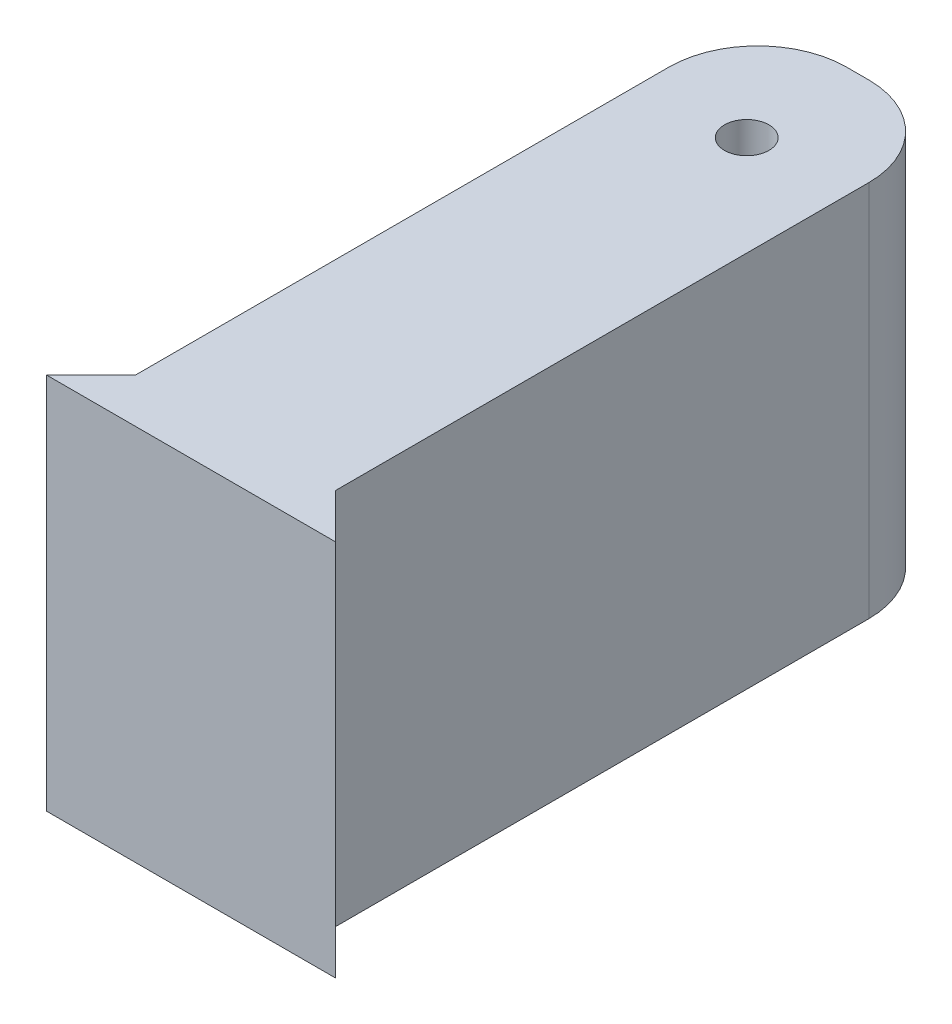
ISO-10303-21;
HEADER;
FILE_DESCRIPTION(('STEP AP214'),'2;1');
FILE_NAME('part.step','',(''),(''),'','','');
FILE_SCHEMA(('AUTOMOTIVE_DESIGN { 1 0 10303 214 1 1 1 1 }'));
ENDSEC;
DATA;
#1=APPLICATION_CONTEXT('core data for automotive mechanical design processes');
#2=APPLICATION_PROTOCOL_DEFINITION('international standard','automotive_design',2000,#1);
#3=PRODUCT_CONTEXT('',#1,'mechanical');
#4=PRODUCT('Part','Part','',(#3));
#5=PRODUCT_RELATED_PRODUCT_CATEGORY('part','',(#4));
#6=PRODUCT_DEFINITION_FORMATION('','',#4);
#7=PRODUCT_DEFINITION_CONTEXT('part definition',#1,'design');
#8=PRODUCT_DEFINITION('design','',#6,#7);
#9=PRODUCT_DEFINITION_SHAPE('','',#8);
#10=(LENGTH_UNIT() NAMED_UNIT(*) SI_UNIT(.MILLI.,.METRE.));
#11=(NAMED_UNIT(*) PLANE_ANGLE_UNIT() SI_UNIT($,.RADIAN.));
#12=(NAMED_UNIT(*) SI_UNIT($,.STERADIAN.) SOLID_ANGLE_UNIT());
#13=UNCERTAINTY_MEASURE_WITH_UNIT(LENGTH_MEASURE(1.E-05),#10,'distance_accuracy_value','');
#14=(GEOMETRIC_REPRESENTATION_CONTEXT(3) GLOBAL_UNCERTAINTY_ASSIGNED_CONTEXT((#13)) GLOBAL_UNIT_ASSIGNED_CONTEXT((#10,
#11,#12)) REPRESENTATION_CONTEXT('',''));
#15=CARTESIAN_POINT('',(0.,0.,0.));
#16=DIRECTION('',(0.,0.,1.));
#17=DIRECTION('',(1.,0.,0.));
#18=AXIS2_PLACEMENT_3D('',#15,#16,#17);
#19=CARTESIAN_POINT('',(0.,0.,-450.));
#20=DIRECTION('',(0.,0.,-1.));
#21=DIRECTION('',(-1.,0.,0.));
#22=AXIS2_PLACEMENT_3D('',#19,#20,#21);
#23=PLANE('',#22);
#24=DIRECTION('',(1.,0.,0.));
#25=VECTOR('',#24,1.);
#26=CARTESIAN_POINT('',(0.,-28.,-450.));
#27=LINE('',#26,#25);
#28=CARTESIAN_POINT('',(-61.0000000000001,-28.,-450.));
#29=VERTEX_POINT('',#28);
#30=CARTESIAN_POINT('',(-48.0000000000002,-28.,-450.));
#31=VERTEX_POINT('',#30);
#32=EDGE_CURVE('E464',#29,#31,#27,.T.);
#33=ORIENTED_EDGE('',*,*,#32,.F.);
#34=DIRECTION('',(0.,1.,0.));
#35=VECTOR('',#34,1.);
#36=CARTESIAN_POINT('',(-61.0000000000001,-44.9978351411707,-450.));
#37=LINE('',#36,#35);
#38=CARTESIAN_POINT('',(-61.0000000000001,-44.9978351411707,-450.));
#39=VERTEX_POINT('',#38);
#40=EDGE_CURVE('E452',#29,#39,#37,.F.);
#41=ORIENTED_EDGE('',*,*,#40,.T.);
#42=DIRECTION('',(1.,0.,0.));
#43=VECTOR('',#42,1.);
#44=CARTESIAN_POINT('',(-59.0000000000001,-44.9978351411707,-450.));
#45=LINE('',#44,#43);
#46=CARTESIAN_POINT('',(-48.0000000000001,-44.9978351411707,-450.));
#47=VERTEX_POINT('',#46);
#48=EDGE_CURVE('E501',#39,#47,#45,.T.);
#49=ORIENTED_EDGE('',*,*,#48,.T.);
#50=DIRECTION('',(0.,1.,0.));
#51=VECTOR('',#50,1.);
#52=CARTESIAN_POINT('',(-48.0000000000002,-28.,-450.));
#53=LINE('',#52,#51);
#54=EDGE_CURVE('E378',#47,#31,#53,.T.);
#55=ORIENTED_EDGE('',*,*,#54,.T.);
#56=EDGE_LOOP('',(#33,#41,#49,#55));
#57=FACE_BOUND('',#56,.T.);
#58=ADVANCED_FACE('F374',(#57),#23,.F.);
#59=CARTESIAN_POINT('',(-54.0000000000001,-44.9978351411707,-476.));
#60=DIRECTION('',(0.,1.,0.));
#61=DIRECTION('',(0.,0.,1.));
#62=AXIS2_PLACEMENT_3D('',#59,#60,#61);
#63=CYLINDRICAL_SURFACE('',#62,4.);
#64=CARTESIAN_POINT('',(-54.0000000000001,-28.,-476.));
#65=DIRECTION('',(0.,1.,0.));
#66=DIRECTION('',(0.,0.,-1.));
#67=AXIS2_PLACEMENT_3D('',#64,#65,#66);
#68=CIRCLE('',#67,4.);
#69=CARTESIAN_POINT('',(-50.0000000000001,-28.,-476.));
#70=VERTEX_POINT('',#69);
#71=CARTESIAN_POINT('',(-54.0000000000001,-28.,-480.));
#72=VERTEX_POINT('',#71);
#73=EDGE_CURVE('E490',#70,#72,#68,.T.);
#74=ORIENTED_EDGE('',*,*,#73,.F.);
#75=DIRECTION('',(0.,1.,0.));
#76=VECTOR('',#75,1.);
#77=CARTESIAN_POINT('',(-50.0000000000001,-44.9978351411707,-476.));
#78=LINE('',#77,#76);
#79=CARTESIAN_POINT('',(-50.0000000000001,-44.9978351411707,-476.));
#80=VERTEX_POINT('',#79);
#81=EDGE_CURVE('E477',#80,#70,#78,.T.);
#82=ORIENTED_EDGE('',*,*,#81,.F.);
#83=CARTESIAN_POINT('',(-54.0000000000001,-44.9978351411707,-476.));
#84=DIRECTION('',(0.,1.,0.));
#85=DIRECTION('',(0.,0.,-1.));
#86=AXIS2_PLACEMENT_3D('',#83,#84,#85);
#87=CIRCLE('',#86,4.);
#88=CARTESIAN_POINT('',(-54.0000000000001,-44.9978351411707,-480.));
#89=VERTEX_POINT('',#88);
#90=EDGE_CURVE('E497',#80,#89,#87,.T.);
#91=ORIENTED_EDGE('',*,*,#90,.T.);
#92=DIRECTION('',(0.,1.,0.));
#93=VECTOR('',#92,1.);
#94=CARTESIAN_POINT('',(-54.0000000000001,-44.9978351411707,-480.));
#95=LINE('',#94,#93);
#96=EDGE_CURVE('E411',#89,#72,#95,.T.);
#97=ORIENTED_EDGE('',*,*,#96,.T.);
#98=EDGE_LOOP('',(#74,#82,#91,#97));
#99=FACE_BOUND('',#98,.T.);
#100=ADVANCED_FACE('F515',(#99),#63,.T.);
#101=CARTESIAN_POINT('',(-55.0000000000001,-44.9978351411707,-480.));
#102=DIRECTION('',(0.,0.,-1.));
#103=DIRECTION('',(-1.,0.,0.));
#104=AXIS2_PLACEMENT_3D('',#101,#102,#103);
#105=PLANE('',#104);
#106=DIRECTION('',(-1.,0.,0.));
#107=VECTOR('',#106,1.);
#108=CARTESIAN_POINT('',(-55.0000000000001,-28.,-480.));
#109=LINE('',#108,#107);
#110=CARTESIAN_POINT('',(-55.0000000000001,-28.,-480.));
#111=VERTEX_POINT('',#110);
#112=EDGE_CURVE('E486',#72,#111,#109,.T.);
#113=ORIENTED_EDGE('',*,*,#112,.F.);
#114=ORIENTED_EDGE('',*,*,#96,.F.);
#115=DIRECTION('',(-1.,0.,0.));
#116=VECTOR('',#115,1.);
#117=CARTESIAN_POINT('',(-55.0000000000001,-44.9978351411707,-480.));
#118=LINE('',#117,#116);
#119=CARTESIAN_POINT('',(-55.0000000000001,-44.9978351411707,-480.));
#120=VERTEX_POINT('',#119);
#121=EDGE_CURVE('E495',#89,#120,#118,.T.);
#122=ORIENTED_EDGE('',*,*,#121,.T.);
#123=DIRECTION('',(0.,1.,0.));
#124=VECTOR('',#123,1.);
#125=CARTESIAN_POINT('',(-55.0000000000001,-44.9978351411707,-480.));
#126=LINE('',#125,#124);
#127=EDGE_CURVE('E481',#120,#111,#126,.T.);
#128=ORIENTED_EDGE('',*,*,#127,.T.);
#129=EDGE_LOOP('',(#113,#114,#122,#128));
#130=FACE_BOUND('',#129,.T.);
#131=ADVANCED_FACE('F511',(#130),#105,.T.);
#132=CARTESIAN_POINT('',(-55.0000000000001,-44.9978351411707,-476.));
#133=DIRECTION('',(0.,1.,0.));
#134=DIRECTION('',(0.,0.,1.));
#135=AXIS2_PLACEMENT_3D('',#132,#133,#134);
#136=CYLINDRICAL_SURFACE('',#135,4.);
#137=CARTESIAN_POINT('',(-55.0000000000001,-28.,-476.));
#138=DIRECTION('',(0.,1.,0.));
#139=DIRECTION('',(0.,0.,-1.));
#140=AXIS2_PLACEMENT_3D('',#137,#138,#139);
#141=CIRCLE('',#140,4.);
#142=CARTESIAN_POINT('',(-59.0000000000001,-28.,-476.));
#143=VERTEX_POINT('',#142);
#144=EDGE_CURVE('E484',#111,#143,#141,.T.);
#145=ORIENTED_EDGE('',*,*,#144,.F.);
#146=ORIENTED_EDGE('',*,*,#127,.F.);
#147=CARTESIAN_POINT('',(-55.0000000000001,-44.9978351411707,-476.));
#148=DIRECTION('',(0.,1.,0.));
#149=DIRECTION('',(0.,0.,-1.));
#150=AXIS2_PLACEMENT_3D('',#147,#148,#149);
#151=CIRCLE('',#150,4.);
#152=CARTESIAN_POINT('',(-59.0000000000001,-44.9978351411707,-476.));
#153=VERTEX_POINT('',#152);
#154=EDGE_CURVE('E479',#120,#153,#151,.T.);
#155=ORIENTED_EDGE('',*,*,#154,.T.);
#156=DIRECTION('',(0.,1.,0.));
#157=VECTOR('',#156,1.);
#158=CARTESIAN_POINT('',(-59.0000000000001,-44.9978351411707,-476.));
#159=LINE('',#158,#157);
#160=EDGE_CURVE('E425',#153,#143,#159,.T.);
#161=ORIENTED_EDGE('',*,*,#160,.T.);
#162=EDGE_LOOP('',(#145,#146,#155,#161));
#163=FACE_BOUND('',#162,.T.);
#164=ADVANCED_FACE('F510',(#163),#136,.T.);
#165=CARTESIAN_POINT('',(-54.5000000000001,-82.2381182195122,-475.005635025594));
#166=DIRECTION('',(0.,1.,0.));
#167=DIRECTION('',(0.,0.,1.));
#168=AXIS2_PLACEMENT_3D('',#165,#166,#167);
#169=CYLINDRICAL_SURFACE('',#168,0.999999999999998);
#170=CARTESIAN_POINT('',(-54.5000000000001,-44.9978351411707,-475.005635025594));
#171=DIRECTION('',(0.,-1.,0.));
#172=DIRECTION('',(0.,0.,-1.));
#173=AXIS2_PLACEMENT_3D('',#170,#171,#172);
#174=CIRCLE('',#173,0.999999999999998);
#175=CARTESIAN_POINT('',(-54.5000000000001,-44.9978351411707,-476.005635025594));
#176=VERTEX_POINT('',#175);
#177=EDGE_CURVE('E384',#176,#176,#174,.T.);
#178=ORIENTED_EDGE('',*,*,#177,.T.);
#179=EDGE_LOOP('',(#178));
#180=FACE_BOUND('',#179,.T.);
#181=CARTESIAN_POINT('',(-54.5000000000001,-28.,-475.005635025594));
#182=DIRECTION('',(0.,1.,0.));
#183=DIRECTION('',(0.,0.,1.));
#184=AXIS2_PLACEMENT_3D('',#181,#182,#183);
#185=CIRCLE('',#184,0.999999999999998);
#186=CARTESIAN_POINT('',(-54.5000000000001,-28.,-474.005635025594));
#187=VERTEX_POINT('',#186);
#188=EDGE_CURVE('E13',#187,#187,#185,.T.);
#189=ORIENTED_EDGE('',*,*,#188,.T.);
#190=EDGE_LOOP('',(#189));
#191=FACE_BOUND('',#190,.T.);
#192=ADVANCED_FACE('F543',(#180,#191),#169,.F.);
#193=CARTESIAN_POINT('',(-59.0000000000001,-44.9978351411707,-450.));
#194=DIRECTION('',(-1.,0.,0.));
#195=DIRECTION('',(0.,0.,1.));
#196=AXIS2_PLACEMENT_3D('',#193,#194,#195);
#197=PLANE('',#196);
#198=DIRECTION('',(0.,0.,1.));
#199=VECTOR('',#198,1.);
#200=CARTESIAN_POINT('',(-59.0000000000001,-44.9978351411707,-450.));
#201=LINE('',#200,#199);
#202=CARTESIAN_POINT('',(-59.0000000000001,-44.9978351411707,-452.));
#203=VERTEX_POINT('',#202);
#204=EDGE_CURVE('E487',#153,#203,#201,.T.);
#205=ORIENTED_EDGE('',*,*,#204,.T.);
#206=DIRECTION('',(0.,1.,0.));
#207=VECTOR('',#206,1.);
#208=CARTESIAN_POINT('',(-59.0000000000001,-28.,-452.));
#209=LINE('',#208,#207);
#210=CARTESIAN_POINT('',(-59.0000000000001,-28.,-452.));
#211=VERTEX_POINT('',#210);
#212=EDGE_CURVE('E470',#203,#211,#209,.T.);
#213=ORIENTED_EDGE('',*,*,#212,.T.);
#214=DIRECTION('',(0.,0.,1.));
#215=VECTOR('',#214,1.);
#216=CARTESIAN_POINT('',(-59.0000000000001,-28.,-450.));
#217=LINE('',#216,#215);
#218=EDGE_CURVE('E469',#143,#211,#217,.T.);
#219=ORIENTED_EDGE('',*,*,#218,.F.);
#220=ORIENTED_EDGE('',*,*,#160,.F.);
#221=EDGE_LOOP('',(#205,#213,#219,#220));
#222=FACE_BOUND('',#221,.T.);
#223=ADVANCED_FACE('F506',(#222),#197,.T.);
#224=CARTESIAN_POINT('',(0.,-28.,0.));
#225=DIRECTION('',(0.,-1.,0.));
#226=DIRECTION('',(0.,0.,-1.));
#227=AXIS2_PLACEMENT_3D('',#224,#225,#226);
#228=PLANE('',#227);
#229=ORIENTED_EDGE('',*,*,#188,.F.);
#230=EDGE_LOOP('',(#229));
#231=FACE_BOUND('',#230,.T.);
#232=DIRECTION('',(0.707106781186548,0.,-0.707106781186548));
#233=VECTOR('',#232,1.);
#234=CARTESIAN_POINT('',(-255.5,-28.,-255.5));
#235=LINE('',#234,#233);
#236=EDGE_CURVE('E457',#211,#29,#235,.F.);
#237=ORIENTED_EDGE('',*,*,#236,.T.);
#238=ORIENTED_EDGE('',*,*,#32,.T.);
#239=DIRECTION('',(0.707106781186557,0.,0.707106781186538));
#240=VECTOR('',#239,1.);
#241=CARTESIAN_POINT('',(201.000000000001,-28.,-201.000000000006));
#242=LINE('',#241,#240);
#243=CARTESIAN_POINT('',(-50.0000000000001,-28.,-452.));
#244=VERTEX_POINT('',#243);
#245=EDGE_CURVE('E522',#31,#244,#242,.F.);
#246=ORIENTED_EDGE('',*,*,#245,.T.);
#247=DIRECTION('',(0.,0.,-1.));
#248=VECTOR('',#247,1.);
#249=CARTESIAN_POINT('',(-50.0000000000001,-28.,-450.));
#250=LINE('',#249,#248);
#251=EDGE_CURVE('E393',#244,#70,#250,.T.);
#252=ORIENTED_EDGE('',*,*,#251,.T.);
#253=ORIENTED_EDGE('',*,*,#73,.T.);
#254=ORIENTED_EDGE('',*,*,#112,.T.);
#255=ORIENTED_EDGE('',*,*,#144,.T.);
#256=ORIENTED_EDGE('',*,*,#218,.T.);
#257=EDGE_LOOP('',(#237,#238,#246,#252,#253,#254,#255,#256));
#258=FACE_BOUND('',#257,.T.);
#259=ADVANCED_FACE('F376',(#231,#258),#228,.F.);
#260=CARTESIAN_POINT('',(-50.0000000000001,-44.9978351411707,-450.));
#261=DIRECTION('',(1.,0.,0.));
#262=DIRECTION('',(0.,0.,-1.));
#263=AXIS2_PLACEMENT_3D('',#260,#261,#262);
#264=PLANE('',#263);
#265=ORIENTED_EDGE('',*,*,#251,.F.);
#266=DIRECTION('',(0.,-1.,0.));
#267=VECTOR('',#266,1.);
#268=CARTESIAN_POINT('',(-50.0000000000001,-44.9597979089117,-452.));
#269=LINE('',#268,#267);
#270=CARTESIAN_POINT('',(-50.0000000000001,-44.9978351411707,-452.));
#271=VERTEX_POINT('',#270);
#272=EDGE_CURVE('E518',#244,#271,#269,.T.);
#273=ORIENTED_EDGE('',*,*,#272,.T.);
#274=DIRECTION('',(0.,0.,-1.));
#275=VECTOR('',#274,1.);
#276=CARTESIAN_POINT('',(-50.0000000000001,-44.9978351411707,-450.));
#277=LINE('',#276,#275);
#278=EDGE_CURVE('E418',#271,#80,#277,.T.);
#279=ORIENTED_EDGE('',*,*,#278,.T.);
#280=ORIENTED_EDGE('',*,*,#81,.T.);
#281=EDGE_LOOP('',(#265,#273,#279,#280));
#282=FACE_BOUND('',#281,.T.);
#283=ADVANCED_FACE('F516',(#282),#264,.T.);
#284=CARTESIAN_POINT('',(-55.0000000000001,-44.9978351411707,-476.));
#285=DIRECTION('',(0.,-1.,0.));
#286=DIRECTION('',(0.,0.,-1.));
#287=AXIS2_PLACEMENT_3D('',#284,#285,#286);
#288=PLANE('',#287);
#289=ORIENTED_EDGE('',*,*,#177,.F.);
#290=EDGE_LOOP('',(#289));
#291=FACE_BOUND('',#290,.T.);
#292=ORIENTED_EDGE('',*,*,#204,.F.);
#293=ORIENTED_EDGE('',*,*,#154,.F.);
#294=ORIENTED_EDGE('',*,*,#121,.F.);
#295=ORIENTED_EDGE('',*,*,#90,.F.);
#296=ORIENTED_EDGE('',*,*,#278,.F.);
#297=DIRECTION('',(-0.707106781186557,0.,-0.707106781186538));
#298=VECTOR('',#297,1.);
#299=CARTESIAN_POINT('',(-48.0000000000002,-44.9978351411707,-450.));
#300=LINE('',#299,#298);
#301=EDGE_CURVE('E466',#271,#47,#300,.F.);
#302=ORIENTED_EDGE('',*,*,#301,.T.);
#303=ORIENTED_EDGE('',*,*,#48,.F.);
#304=DIRECTION('',(-0.707106781186548,0.,0.707106781186548));
#305=VECTOR('',#304,1.);
#306=CARTESIAN_POINT('',(-59.0000000000001,-44.9978351411707,-452.));
#307=LINE('',#306,#305);
#308=EDGE_CURVE('E459',#39,#203,#307,.F.);
#309=ORIENTED_EDGE('',*,*,#308,.T.);
#310=EDGE_LOOP('',(#292,#293,#294,#295,#296,#302,#303,#309));
#311=FACE_BOUND('',#310,.T.);
#312=ADVANCED_FACE('F509',(#291,#311),#288,.T.);
#313=CARTESIAN_POINT('',(-48.0000000000002,0.,-450.));
#314=DIRECTION('',(0.707106781186538,0.,-0.707106781186557));
#315=DIRECTION('',(0.,-1.,0.));
#316=AXIS2_PLACEMENT_3D('',#313,#314,#315);
#317=PLANE('',#316);
#318=ORIENTED_EDGE('',*,*,#301,.F.);
#319=ORIENTED_EDGE('',*,*,#272,.F.);
#320=ORIENTED_EDGE('',*,*,#245,.F.);
#321=ORIENTED_EDGE('',*,*,#54,.F.);
#322=EDGE_LOOP('',(#318,#319,#320,#321));
#323=FACE_BOUND('',#322,.T.);
#324=ADVANCED_FACE('F521',(#323),#317,.T.);
#325=CARTESIAN_POINT('',(-59.0000000000001,-44.9978351411707,-452.));
#326=DIRECTION('',(-0.707106781186547,0.,-0.707106781186547));
#327=DIRECTION('',(0.,-1.,0.));
#328=AXIS2_PLACEMENT_3D('',#325,#326,#327);
#329=PLANE('',#328);
#330=ORIENTED_EDGE('',*,*,#40,.F.);
#331=ORIENTED_EDGE('',*,*,#236,.F.);
#332=ORIENTED_EDGE('',*,*,#212,.F.);
#333=ORIENTED_EDGE('',*,*,#308,.F.);
#334=EDGE_LOOP('',(#330,#331,#332,#333));
#335=FACE_BOUND('',#334,.T.);
#336=ADVANCED_FACE('F454',(#335),#329,.T.);
#337=CLOSED_SHELL('',(#58,#100,#131,#164,#192,#223,#259,#283,#312,#324,#336));
#338=MANIFOLD_SOLID_BREP('B2',#337);
#339=ADVANCED_BREP_SHAPE_REPRESENTATION('',(#18,#338),#14);
#340=SHAPE_DEFINITION_REPRESENTATION(#9,#339);
ENDSEC;
END-ISO-10303-21;
